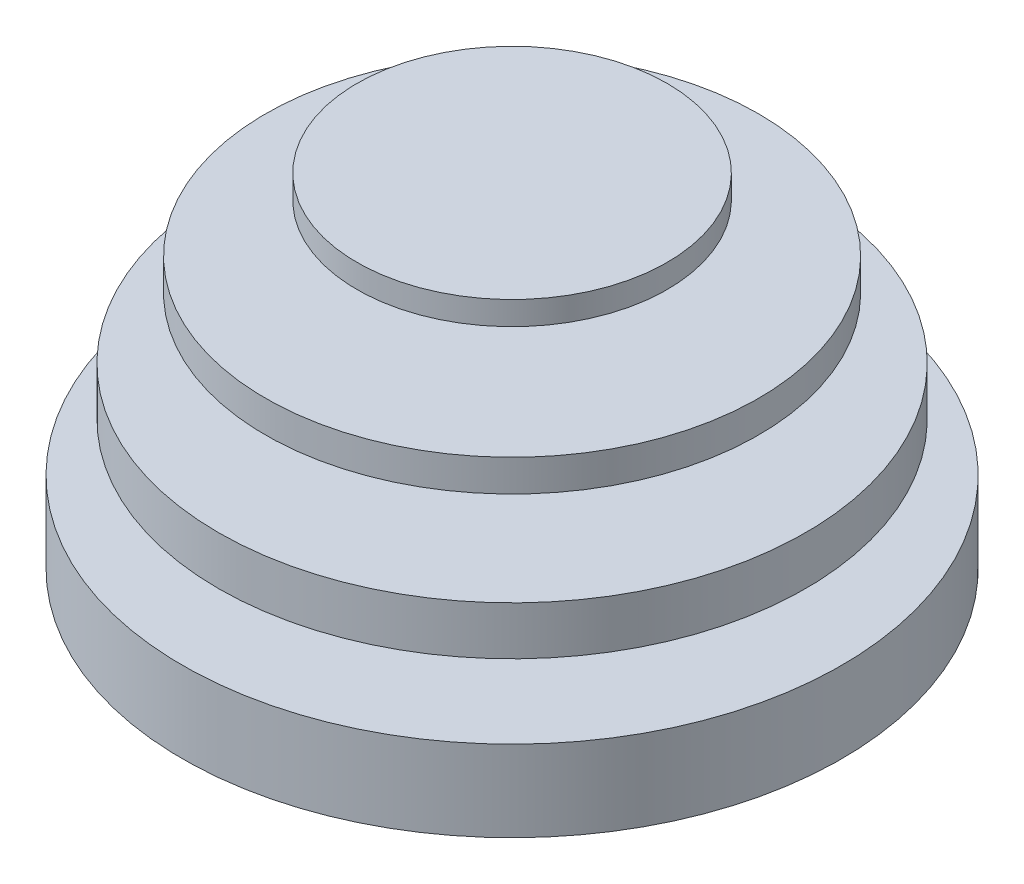
ISO-10303-21;
HEADER;
FILE_DESCRIPTION(('STEP AP214'),'2;1');
FILE_NAME('part.step','',(''),(''),'','','');
FILE_SCHEMA(('AUTOMOTIVE_DESIGN { 1 0 10303 214 1 1 1 1 }'));
ENDSEC;
DATA;
#1=APPLICATION_CONTEXT('core data for automotive mechanical design processes');
#2=APPLICATION_PROTOCOL_DEFINITION('international standard','automotive_design',2000,#1);
#3=PRODUCT_CONTEXT('',#1,'mechanical');
#4=PRODUCT('Part','Part','',(#3));
#5=PRODUCT_RELATED_PRODUCT_CATEGORY('part','',(#4));
#6=PRODUCT_DEFINITION_FORMATION('','',#4);
#7=PRODUCT_DEFINITION_CONTEXT('part definition',#1,'design');
#8=PRODUCT_DEFINITION('design','',#6,#7);
#9=PRODUCT_DEFINITION_SHAPE('','',#8);
#10=(LENGTH_UNIT() NAMED_UNIT(*) SI_UNIT(.MILLI.,.METRE.));
#11=(NAMED_UNIT(*) PLANE_ANGLE_UNIT() SI_UNIT($,.RADIAN.));
#12=(NAMED_UNIT(*) SI_UNIT($,.STERADIAN.) SOLID_ANGLE_UNIT());
#13=UNCERTAINTY_MEASURE_WITH_UNIT(LENGTH_MEASURE(1.E-05),#10,'distance_accuracy_value','');
#14=(GEOMETRIC_REPRESENTATION_CONTEXT(3) GLOBAL_UNCERTAINTY_ASSIGNED_CONTEXT((#13)) GLOBAL_UNIT_ASSIGNED_CONTEXT((#10,
#11,#12)) REPRESENTATION_CONTEXT('',''));
#15=CARTESIAN_POINT('',(0.,0.,0.));
#16=DIRECTION('',(0.,0.,1.));
#17=DIRECTION('',(1.,0.,0.));
#18=AXIS2_PLACEMENT_3D('',#15,#16,#17);
#19=CARTESIAN_POINT('',(0.,67.0732075041318,0.));
#20=DIRECTION('',(0.,1.,0.));
#21=DIRECTION('',(0.,0.,1.));
#22=AXIS2_PLACEMENT_3D('',#19,#20,#21);
#23=PLANE('',#22);
#24=CARTESIAN_POINT('',(0.,67.0732075041318,0.));
#25=DIRECTION('',(0.,-1.,0.));
#26=DIRECTION('',(0.,0.,-1.));
#27=AXIS2_PLACEMENT_3D('',#24,#25,#26);
#28=CIRCLE('',#27,30.3523201634859);
#29=CARTESIAN_POINT('',(0.,67.0732075041318,-30.3523201634859));
#30=VERTEX_POINT('',#29);
#31=EDGE_CURVE('E11',#30,#30,#28,.T.);
#32=ORIENTED_EDGE('',*,*,#31,.F.);
#33=EDGE_LOOP('',(#32));
#34=FACE_BOUND('',#33,.T.);
#35=ADVANCED_FACE('F43',(#34),#23,.T.);
#36=CARTESIAN_POINT('',(0.,25.3387672793387,0.));
#37=DIRECTION('',(0.,-1.,0.));
#38=DIRECTION('',(0.,0.,-1.));
#39=AXIS2_PLACEMENT_3D('',#36,#37,#38);
#40=CYLINDRICAL_SURFACE('',#39,30.3523201634859);
#41=ORIENTED_EDGE('',*,*,#31,.T.);
#42=EDGE_LOOP('',(#41));
#43=FACE_BOUND('',#42,.T.);
#44=CARTESIAN_POINT('',(0.,62.4661589078884,0.));
#45=DIRECTION('',(0.,-1.,0.));
#46=DIRECTION('',(0.,0.,-1.));
#47=AXIS2_PLACEMENT_3D('',#44,#45,#46);
#48=CIRCLE('',#47,30.3523201634859);
#49=CARTESIAN_POINT('',(0.,62.4661589078884,-30.3523201634859));
#50=VERTEX_POINT('',#49);
#51=EDGE_CURVE('E49',#50,#50,#48,.T.);
#52=ORIENTED_EDGE('',*,*,#51,.F.);
#53=EDGE_LOOP('',(#52));
#54=FACE_BOUND('',#53,.T.);
#55=ADVANCED_FACE('F57',(#43,#54),#40,.T.);
#56=CARTESIAN_POINT('',(0.,62.4661589078884,0.));
#57=DIRECTION('',(0.,-1.,0.));
#58=DIRECTION('',(0.,0.,-1.));
#59=AXIS2_PLACEMENT_3D('',#56,#57,#58);
#60=PLANE('',#59);
#61=ORIENTED_EDGE('',*,*,#51,.T.);
#62=EDGE_LOOP('',(#61));
#63=FACE_BOUND('',#62,.T.);
#64=ADVANCED_FACE('F55',(#63),#60,.T.);
#65=CLOSED_SHELL('',(#35,#55,#64));
#66=MANIFOLD_SOLID_BREP('B2',#65);
#67=CARTESIAN_POINT('',(0.,52.9810588567991,0.));
#68=DIRECTION('',(0.,1.,0.));
#69=DIRECTION('',(0.,0.,1.));
#70=AXIS2_PLACEMENT_3D('',#67,#68,#69);
#71=PLANE('',#70);
#72=CARTESIAN_POINT('',(0.,52.9810588567991,0.));
#73=DIRECTION('',(0.,-1.,0.));
#74=DIRECTION('',(0.,0.,-1.));
#75=AXIS2_PLACEMENT_3D('',#72,#73,#74);
#76=CIRCLE('',#75,48.2385088312544);
#77=CARTESIAN_POINT('',(0.,52.9810588567991,-48.2385088312544));
#78=VERTEX_POINT('',#77);
#79=EDGE_CURVE('E42',#78,#78,#76,.T.);
#80=ORIENTED_EDGE('',*,*,#79,.F.);
#81=EDGE_LOOP('',(#80));
#82=FACE_BOUND('',#81,.T.);
#83=ADVANCED_FACE('F91',(#82),#71,.T.);
#84=CARTESIAN_POINT('',(0.,25.3387672793387,0.));
#85=DIRECTION('',(0.,-1.,0.));
#86=DIRECTION('',(0.,0.,-1.));
#87=AXIS2_PLACEMENT_3D('',#84,#85,#86);
#88=CYLINDRICAL_SURFACE('',#87,48.2385088312544);
#89=ORIENTED_EDGE('',*,*,#79,.T.);
#90=EDGE_LOOP('',(#89));
#91=FACE_BOUND('',#90,.T.);
#92=CARTESIAN_POINT('',(0.,46.7479931089404,0.));
#93=DIRECTION('',(0.,-1.,0.));
#94=DIRECTION('',(0.,0.,-1.));
#95=AXIS2_PLACEMENT_3D('',#92,#93,#94);
#96=CIRCLE('',#95,48.2385088312544);
#97=CARTESIAN_POINT('',(0.,46.7479931089404,-48.2385088312544));
#98=VERTEX_POINT('',#97);
#99=EDGE_CURVE('E97',#98,#98,#96,.T.);
#100=ORIENTED_EDGE('',*,*,#99,.F.);
#101=EDGE_LOOP('',(#100));
#102=FACE_BOUND('',#101,.T.);
#103=ADVANCED_FACE('F105',(#91,#102),#88,.T.);
#104=CARTESIAN_POINT('',(0.,46.7479931089404,0.));
#105=DIRECTION('',(0.,-1.,0.));
#106=DIRECTION('',(0.,0.,-1.));
#107=AXIS2_PLACEMENT_3D('',#104,#105,#106);
#108=PLANE('',#107);
#109=ORIENTED_EDGE('',*,*,#99,.T.);
#110=EDGE_LOOP('',(#109));
#111=FACE_BOUND('',#110,.T.);
#112=ADVANCED_FACE('F103',(#111),#108,.T.);
#113=CLOSED_SHELL('',(#83,#103,#112));
#114=MANIFOLD_SOLID_BREP('B6',#113);
#115=CARTESIAN_POINT('',(0.,34.823867330428,0.));
#116=DIRECTION('',(0.,1.,0.));
#117=DIRECTION('',(0.,0.,1.));
#118=AXIS2_PLACEMENT_3D('',#115,#116,#117);
#119=PLANE('',#118);
#120=CARTESIAN_POINT('',(0.,34.823867330428,0.));
#121=DIRECTION('',(0.,1.,0.));
#122=DIRECTION('',(0.,0.,1.));
#123=AXIS2_PLACEMENT_3D('',#120,#121,#122);
#124=CIRCLE('',#123,21.9043949486866);
#125=CARTESIAN_POINT('',(0.,34.823867330428,21.9043949486866));
#126=VERTEX_POINT('',#125);
#127=EDGE_CURVE('E149',#126,#126,#124,.T.);
#128=ORIENTED_EDGE('',*,*,#127,.F.);
#129=EDGE_LOOP('',(#128));
#130=FACE_BOUND('',#129,.T.);
#131=CARTESIAN_POINT('',(0.,34.823867330428,0.));
#132=DIRECTION('',(0.,-1.,0.));
#133=DIRECTION('',(0.,0.,-1.));
#134=AXIS2_PLACEMENT_3D('',#131,#132,#133);
#135=CIRCLE('',#134,57.4526060237412);
#136=CARTESIAN_POINT('',(0.,34.823867330428,-57.4526060237412));
#137=VERTEX_POINT('',#136);
#138=EDGE_CURVE('E90',#137,#137,#135,.T.);
#139=ORIENTED_EDGE('',*,*,#138,.F.);
#140=EDGE_LOOP('',(#139));
#141=FACE_BOUND('',#140,.T.);
#142=ADVANCED_FACE('F138',(#130,#141),#119,.T.);
#143=CARTESIAN_POINT('',(0.,25.3387672793387,0.));
#144=DIRECTION('',(0.,-1.,0.));
#145=DIRECTION('',(0.,0.,-1.));
#146=AXIS2_PLACEMENT_3D('',#143,#144,#145);
#147=CYLINDRICAL_SURFACE('',#146,57.4526060237412);
#148=ORIENTED_EDGE('',*,*,#138,.T.);
#149=EDGE_LOOP('',(#148));
#150=FACE_BOUND('',#149,.T.);
#151=CARTESIAN_POINT('',(0.,25.3387672793387,0.));
#152=DIRECTION('',(0.,-1.,0.));
#153=DIRECTION('',(0.,0.,-1.));
#154=AXIS2_PLACEMENT_3D('',#151,#152,#153);
#155=CIRCLE('',#154,57.4526060237412);
#156=CARTESIAN_POINT('',(0.,25.3387672793387,-57.4526060237412));
#157=VERTEX_POINT('',#156);
#158=EDGE_CURVE('E145',#157,#157,#155,.T.);
#159=ORIENTED_EDGE('',*,*,#158,.F.);
#160=EDGE_LOOP('',(#159));
#161=FACE_BOUND('',#160,.T.);
#162=ADVANCED_FACE('F163',(#150,#161),#147,.T.);
#163=CARTESIAN_POINT('',(0.,25.3387672793387,0.));
#164=DIRECTION('',(0.,-1.,0.));
#165=DIRECTION('',(0.,0.,-1.));
#166=AXIS2_PLACEMENT_3D('',#163,#164,#165);
#167=PLANE('',#166);
#168=CARTESIAN_POINT('',(0.,25.3387672793387,0.));
#169=DIRECTION('',(0.,-1.,0.));
#170=DIRECTION('',(0.,0.,-1.));
#171=AXIS2_PLACEMENT_3D('',#168,#169,#170);
#172=CIRCLE('',#171,21.9043949486866);
#173=CARTESIAN_POINT('',(0.,25.3387672793387,-21.9043949486866));
#174=VERTEX_POINT('',#173);
#175=EDGE_CURVE('E141',#174,#174,#172,.T.);
#176=ORIENTED_EDGE('',*,*,#175,.F.);
#177=EDGE_LOOP('',(#176));
#178=FACE_BOUND('',#177,.T.);
#179=ORIENTED_EDGE('',*,*,#158,.T.);
#180=EDGE_LOOP('',(#179));
#181=FACE_BOUND('',#180,.T.);
#182=ADVANCED_FACE('F160',(#178,#181),#167,.T.);
#183=CARTESIAN_POINT('',(0.,0.,0.));
#184=DIRECTION('',(0.,1.,0.));
#185=DIRECTION('',(0.,0.,1.));
#186=AXIS2_PLACEMENT_3D('',#183,#184,#185);
#187=CYLINDRICAL_SURFACE('',#186,21.9043949486866);
#188=ORIENTED_EDGE('',*,*,#127,.T.);
#189=EDGE_LOOP('',(#188));
#190=FACE_BOUND('',#189,.T.);
#191=ORIENTED_EDGE('',*,*,#175,.T.);
#192=EDGE_LOOP('',(#191));
#193=FACE_BOUND('',#192,.T.);
#194=ADVANCED_FACE('F158',(#190,#193),#187,.F.);
#195=CLOSED_SHELL('',(#142,#162,#182,#194));
#196=MANIFOLD_SOLID_BREP('B37',#195);
#197=CARTESIAN_POINT('',(0.,15.8536672282493,0.));
#198=DIRECTION('',(0.,1.,0.));
#199=DIRECTION('',(0.,0.,1.));
#200=AXIS2_PLACEMENT_3D('',#197,#198,#199);
#201=PLANE('',#200);
#202=CARTESIAN_POINT('',(0.,15.8536672282493,0.));
#203=DIRECTION('',(0.,-1.,0.));
#204=DIRECTION('',(0.,0.,-1.));
#205=AXIS2_PLACEMENT_3D('',#202,#203,#204);
#206=CIRCLE('',#205,64.4986803474076);
#207=CARTESIAN_POINT('',(0.,15.8536672282493,-64.4986803474076));
#208=VERTEX_POINT('',#207);
#209=EDGE_CURVE('E137',#208,#208,#206,.T.);
#210=ORIENTED_EDGE('',*,*,#209,.F.);
#211=EDGE_LOOP('',(#210));
#212=FACE_BOUND('',#211,.T.);
#213=ADVANCED_FACE('F199',(#212),#201,.T.);
#214=CARTESIAN_POINT('',(0.,25.3387672793387,0.));
#215=DIRECTION('',(0.,-1.,0.));
#216=DIRECTION('',(0.,0.,-1.));
#217=AXIS2_PLACEMENT_3D('',#214,#215,#216);
#218=CYLINDRICAL_SURFACE('',#217,64.4986803474076);
#219=ORIENTED_EDGE('',*,*,#209,.T.);
#220=EDGE_LOOP('',(#219));
#221=FACE_BOUND('',#220,.T.);
#222=CARTESIAN_POINT('',(0.,0.,0.));
#223=DIRECTION('',(0.,-1.,0.));
#224=DIRECTION('',(0.,0.,-1.));
#225=AXIS2_PLACEMENT_3D('',#222,#223,#224);
#226=CIRCLE('',#225,64.4986803474076);
#227=CARTESIAN_POINT('',(0.,0.,-64.4986803474076));
#228=VERTEX_POINT('',#227);
#229=EDGE_CURVE('E205',#228,#228,#226,.T.);
#230=ORIENTED_EDGE('',*,*,#229,.F.);
#231=EDGE_LOOP('',(#230));
#232=FACE_BOUND('',#231,.T.);
#233=ADVANCED_FACE('F213',(#221,#232),#218,.T.);
#234=CARTESIAN_POINT('',(0.,0.,0.));
#235=DIRECTION('',(0.,-1.,0.));
#236=DIRECTION('',(0.,0.,-1.));
#237=AXIS2_PLACEMENT_3D('',#234,#235,#236);
#238=PLANE('',#237);
#239=ORIENTED_EDGE('',*,*,#229,.T.);
#240=EDGE_LOOP('',(#239));
#241=FACE_BOUND('',#240,.T.);
#242=ADVANCED_FACE('F211',(#241),#238,.T.);
#243=CLOSED_SHELL('',(#213,#233,#242));
#244=MANIFOLD_SOLID_BREP('B85',#243);
#245=ADVANCED_BREP_SHAPE_REPRESENTATION('',(#18,#66,#114,#196,#244),#14);
#246=SHAPE_DEFINITION_REPRESENTATION(#9,#245);
ENDSEC;
END-ISO-10303-21;
